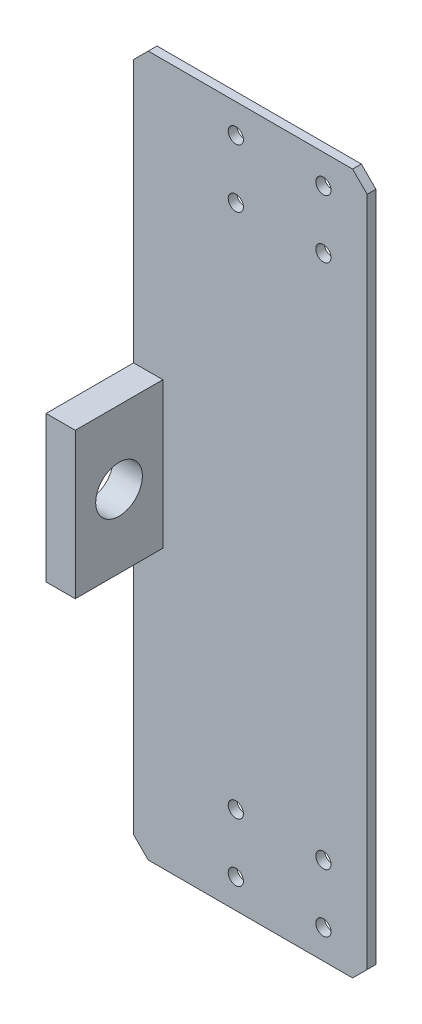
ISO-10303-21;
HEADER;
FILE_DESCRIPTION(('STEP AP214'),'2;1');
FILE_NAME('part.step','',(''),(''),'','','');
FILE_SCHEMA(('AUTOMOTIVE_DESIGN { 1 0 10303 214 1 1 1 1 }'));
ENDSEC;
DATA;
#1=APPLICATION_CONTEXT('core data for automotive mechanical design processes');
#2=APPLICATION_PROTOCOL_DEFINITION('international standard','automotive_design',2000,#1);
#3=PRODUCT_CONTEXT('',#1,'mechanical');
#4=PRODUCT('Part','Part','',(#3));
#5=PRODUCT_RELATED_PRODUCT_CATEGORY('part','',(#4));
#6=PRODUCT_DEFINITION_FORMATION('','',#4);
#7=PRODUCT_DEFINITION_CONTEXT('part definition',#1,'design');
#8=PRODUCT_DEFINITION('design','',#6,#7);
#9=PRODUCT_DEFINITION_SHAPE('','',#8);
#10=(LENGTH_UNIT() NAMED_UNIT(*) SI_UNIT(.MILLI.,.METRE.));
#11=(NAMED_UNIT(*) PLANE_ANGLE_UNIT() SI_UNIT($,.RADIAN.));
#12=(NAMED_UNIT(*) SI_UNIT($,.STERADIAN.) SOLID_ANGLE_UNIT());
#13=UNCERTAINTY_MEASURE_WITH_UNIT(LENGTH_MEASURE(1.E-05),#10,'distance_accuracy_value','');
#14=(GEOMETRIC_REPRESENTATION_CONTEXT(3) GLOBAL_UNCERTAINTY_ASSIGNED_CONTEXT((#13)) GLOBAL_UNIT_ASSIGNED_CONTEXT((#10,
#11,#12)) REPRESENTATION_CONTEXT('',''));
#15=CARTESIAN_POINT('',(0.,0.,0.));
#16=DIRECTION('',(0.,0.,1.));
#17=DIRECTION('',(1.,0.,0.));
#18=AXIS2_PLACEMENT_3D('',#15,#16,#17);
#19=CARTESIAN_POINT('',(0.,0.,3.));
#20=DIRECTION('',(0.,0.,1.));
#21=DIRECTION('',(1.,0.,0.));
#22=AXIS2_PLACEMENT_3D('',#19,#20,#21);
#23=PLANE('',#22);
#24=CARTESIAN_POINT('',(180.,90.,3.));
#25=DIRECTION('',(0.,0.,1.));
#26=DIRECTION('',(1.,0.,0.));
#27=AXIS2_PLACEMENT_3D('',#24,#25,#26);
#28=CIRCLE('',#27,2.59999999999999);
#29=CARTESIAN_POINT('',(182.6,90.,3.));
#30=VERTEX_POINT('',#29);
#31=EDGE_CURVE('E260',#30,#30,#28,.F.);
#32=ORIENTED_EDGE('',*,*,#31,.T.);
#33=EDGE_LOOP('',(#32));
#34=FACE_BOUND('',#33,.T.);
#35=CARTESIAN_POINT('',(180.,110.,3.));
#36=DIRECTION('',(0.,0.,1.));
#37=DIRECTION('',(1.,0.,0.));
#38=AXIS2_PLACEMENT_3D('',#35,#36,#37);
#39=CIRCLE('',#38,2.59999999999999);
#40=CARTESIAN_POINT('',(182.6,110.,3.));
#41=VERTEX_POINT('',#40);
#42=EDGE_CURVE('E268',#41,#41,#39,.F.);
#43=ORIENTED_EDGE('',*,*,#42,.T.);
#44=EDGE_LOOP('',(#43));
#45=FACE_BOUND('',#44,.T.);
#46=CARTESIAN_POINT('',(150.,110.,3.));
#47=DIRECTION('',(0.,0.,1.));
#48=DIRECTION('',(1.,0.,0.));
#49=AXIS2_PLACEMENT_3D('',#46,#47,#48);
#50=CIRCLE('',#49,2.59999999999999);
#51=CARTESIAN_POINT('',(152.6,110.,3.));
#52=VERTEX_POINT('',#51);
#53=EDGE_CURVE('E264',#52,#52,#50,.F.);
#54=ORIENTED_EDGE('',*,*,#53,.T.);
#55=EDGE_LOOP('',(#54));
#56=FACE_BOUND('',#55,.T.);
#57=CARTESIAN_POINT('',(150.,90.,3.));
#58=DIRECTION('',(0.,0.,1.));
#59=DIRECTION('',(1.,0.,0.));
#60=AXIS2_PLACEMENT_3D('',#57,#58,#59);
#61=CIRCLE('',#60,2.59999999999999);
#62=CARTESIAN_POINT('',(152.6,90.,3.));
#63=VERTEX_POINT('',#62);
#64=EDGE_CURVE('E233',#63,#63,#61,.F.);
#65=ORIENTED_EDGE('',*,*,#64,.T.);
#66=EDGE_LOOP('',(#65));
#67=FACE_BOUND('',#66,.T.);
#68=DIRECTION('',(1.,0.,0.));
#69=VECTOR('',#68,1.);
#70=CARTESIAN_POINT('',(115.,-25.,3.));
#71=LINE('',#70,#69);
#72=CARTESIAN_POINT('',(115.,-25.,3.));
#73=VERTEX_POINT('',#72);
#74=CARTESIAN_POINT('',(125.,-25.,3.));
#75=VERTEX_POINT('',#74);
#76=EDGE_CURVE('E59',#73,#75,#71,.T.);
#77=ORIENTED_EDGE('',*,*,#76,.F.);
#78=DIRECTION('',(0.,-1.,0.));
#79=VECTOR('',#78,1.);
#80=CARTESIAN_POINT('',(115.,0.,3.));
#81=LINE('',#80,#79);
#82=CARTESIAN_POINT('',(115.,-115.,3.));
#83=VERTEX_POINT('',#82);
#84=EDGE_CURVE('E151',#73,#83,#81,.T.);
#85=ORIENTED_EDGE('',*,*,#84,.T.);
#86=DIRECTION('',(-0.707106781186546,0.707106781186549,0.));
#87=VECTOR('',#86,1.);
#88=CARTESIAN_POINT('',(2.64953102402888E-13,2.64953102402886E-13,3.));
#89=LINE('',#88,#87);
#90=CARTESIAN_POINT('',(120.,-120.,3.));
#91=VERTEX_POINT('',#90);
#92=EDGE_CURVE('E175',#91,#83,#89,.T.);
#93=ORIENTED_EDGE('',*,*,#92,.F.);
#94=DIRECTION('',(1.,0.,0.));
#95=VECTOR('',#94,1.);
#96=CARTESIAN_POINT('',(0.,-120.,3.));
#97=LINE('',#96,#95);
#98=CARTESIAN_POINT('',(190.,-120.,3.));
#99=VERTEX_POINT('',#98);
#100=EDGE_CURVE('E196',#91,#99,#97,.T.);
#101=ORIENTED_EDGE('',*,*,#100,.T.);
#102=DIRECTION('',(0.707106781186543,0.707106781186552,0.));
#103=VECTOR('',#102,1.);
#104=CARTESIAN_POINT('',(155.000000000001,-154.999999999999,3.));
#105=LINE('',#104,#103);
#106=CARTESIAN_POINT('',(195.,-115.,3.));
#107=VERTEX_POINT('',#106);
#108=EDGE_CURVE('E198',#99,#107,#105,.T.);
#109=ORIENTED_EDGE('',*,*,#108,.T.);
#110=DIRECTION('',(0.,-1.,0.));
#111=VECTOR('',#110,1.);
#112=CARTESIAN_POINT('',(195.,0.,3.));
#113=LINE('',#112,#111);
#114=CARTESIAN_POINT('',(195.,115.,3.));
#115=VERTEX_POINT('',#114);
#116=EDGE_CURVE('E201',#115,#107,#113,.T.);
#117=ORIENTED_EDGE('',*,*,#116,.F.);
#118=DIRECTION('',(0.707106781186543,-0.707106781186552,0.));
#119=VECTOR('',#118,1.);
#120=CARTESIAN_POINT('',(155.000000000001,154.999999999999,3.));
#121=LINE('',#120,#119);
#122=CARTESIAN_POINT('',(190.,120.,3.));
#123=VERTEX_POINT('',#122);
#124=EDGE_CURVE('E204',#123,#115,#121,.T.);
#125=ORIENTED_EDGE('',*,*,#124,.F.);
#126=DIRECTION('',(1.,0.,0.));
#127=VECTOR('',#126,1.);
#128=CARTESIAN_POINT('',(0.,120.,3.));
#129=LINE('',#128,#127);
#130=CARTESIAN_POINT('',(120.,120.,3.));
#131=VERTEX_POINT('',#130);
#132=EDGE_CURVE('E207',#131,#123,#129,.T.);
#133=ORIENTED_EDGE('',*,*,#132,.F.);
#134=DIRECTION('',(0.707106781186548,0.707106781186548,0.));
#135=VECTOR('',#134,1.);
#136=CARTESIAN_POINT('',(0.,0.,3.));
#137=LINE('',#136,#135);
#138=CARTESIAN_POINT('',(115.,115.,3.));
#139=VERTEX_POINT('',#138);
#140=EDGE_CURVE('E184',#139,#131,#137,.T.);
#141=ORIENTED_EDGE('',*,*,#140,.F.);
#142=CARTESIAN_POINT('',(115.,25.,3.));
#143=VERTEX_POINT('',#142);
#144=EDGE_CURVE('E181',#139,#143,#81,.T.);
#145=ORIENTED_EDGE('',*,*,#144,.T.);
#146=DIRECTION('',(1.,0.,0.));
#147=VECTOR('',#146,1.);
#148=CARTESIAN_POINT('',(115.,25.,3.));
#149=LINE('',#148,#147);
#150=CARTESIAN_POINT('',(125.,25.,3.));
#151=VERTEX_POINT('',#150);
#152=EDGE_CURVE('E144',#143,#151,#149,.T.);
#153=ORIENTED_EDGE('',*,*,#152,.T.);
#154=DIRECTION('',(0.,-1.,0.));
#155=VECTOR('',#154,1.);
#156=CARTESIAN_POINT('',(125.,25.,3.));
#157=LINE('',#156,#155);
#158=EDGE_CURVE('E163',#151,#75,#157,.T.);
#159=ORIENTED_EDGE('',*,*,#158,.T.);
#160=EDGE_LOOP('',(#77,#85,#93,#101,#109,#117,#125,#133,#141,#145,#153,#159));
#161=FACE_BOUND('',#160,.T.);
#162=CARTESIAN_POINT('',(180.,-90.,3.));
#163=DIRECTION('',(0.,0.,1.));
#164=DIRECTION('',(1.,0.,0.));
#165=AXIS2_PLACEMENT_3D('',#162,#163,#164);
#166=CIRCLE('',#165,2.59999999999999);
#167=CARTESIAN_POINT('',(182.6,-90.,3.));
#168=VERTEX_POINT('',#167);
#169=EDGE_CURVE('E273',#168,#168,#166,.T.);
#170=ORIENTED_EDGE('',*,*,#169,.F.);
#171=EDGE_LOOP('',(#170));
#172=FACE_BOUND('',#171,.T.);
#173=CARTESIAN_POINT('',(180.,-110.,3.));
#174=DIRECTION('',(0.,0.,1.));
#175=DIRECTION('',(1.,0.,0.));
#176=AXIS2_PLACEMENT_3D('',#173,#174,#175);
#177=CIRCLE('',#176,2.59999999999999);
#178=CARTESIAN_POINT('',(182.6,-110.,3.));
#179=VERTEX_POINT('',#178);
#180=EDGE_CURVE('E276',#179,#179,#177,.T.);
#181=ORIENTED_EDGE('',*,*,#180,.F.);
#182=EDGE_LOOP('',(#181));
#183=FACE_BOUND('',#182,.T.);
#184=CARTESIAN_POINT('',(150.,-110.,3.));
#185=DIRECTION('',(0.,0.,1.));
#186=DIRECTION('',(1.,0.,0.));
#187=AXIS2_PLACEMENT_3D('',#184,#185,#186);
#188=CIRCLE('',#187,2.59999999999999);
#189=CARTESIAN_POINT('',(152.6,-110.,3.));
#190=VERTEX_POINT('',#189);
#191=EDGE_CURVE('E265',#190,#190,#188,.T.);
#192=ORIENTED_EDGE('',*,*,#191,.F.);
#193=EDGE_LOOP('',(#192));
#194=FACE_BOUND('',#193,.T.);
#195=CARTESIAN_POINT('',(150.,-90.,3.));
#196=DIRECTION('',(0.,0.,1.));
#197=DIRECTION('',(1.,0.,0.));
#198=AXIS2_PLACEMENT_3D('',#195,#196,#197);
#199=CIRCLE('',#198,2.59999999999999);
#200=CARTESIAN_POINT('',(152.6,-90.,3.));
#201=VERTEX_POINT('',#200);
#202=EDGE_CURVE('E261',#201,#201,#199,.T.);
#203=ORIENTED_EDGE('',*,*,#202,.F.);
#204=EDGE_LOOP('',(#203));
#205=FACE_BOUND('',#204,.T.);
#206=ADVANCED_FACE('F42',(#34,#45,#56,#67,#161,#172,#183,#194,#205),#23,.T.);
#207=CARTESIAN_POINT('',(0.,0.,0.));
#208=DIRECTION('',(0.,0.,1.));
#209=DIRECTION('',(1.,0.,0.));
#210=AXIS2_PLACEMENT_3D('',#207,#208,#209);
#211=PLANE('',#210);
#212=CARTESIAN_POINT('',(180.,90.,0.));
#213=DIRECTION('',(0.,0.,1.));
#214=DIRECTION('',(1.,0.,0.));
#215=AXIS2_PLACEMENT_3D('',#212,#213,#214);
#216=CIRCLE('',#215,2.59999999999999);
#217=CARTESIAN_POINT('',(182.6,90.,0.));
#218=VERTEX_POINT('',#217);
#219=EDGE_CURVE('E46',#218,#218,#216,.F.);
#220=ORIENTED_EDGE('',*,*,#219,.F.);
#221=EDGE_LOOP('',(#220));
#222=FACE_BOUND('',#221,.T.);
#223=CARTESIAN_POINT('',(180.,110.,0.));
#224=DIRECTION('',(0.,0.,1.));
#225=DIRECTION('',(1.,0.,0.));
#226=AXIS2_PLACEMENT_3D('',#223,#224,#225);
#227=CIRCLE('',#226,2.59999999999999);
#228=CARTESIAN_POINT('',(182.6,110.,0.));
#229=VERTEX_POINT('',#228);
#230=EDGE_CURVE('E247',#229,#229,#227,.F.);
#231=ORIENTED_EDGE('',*,*,#230,.F.);
#232=EDGE_LOOP('',(#231));
#233=FACE_BOUND('',#232,.T.);
#234=CARTESIAN_POINT('',(150.,110.,0.));
#235=DIRECTION('',(0.,0.,1.));
#236=DIRECTION('',(1.,0.,0.));
#237=AXIS2_PLACEMENT_3D('',#234,#235,#236);
#238=CIRCLE('',#237,2.59999999999999);
#239=CARTESIAN_POINT('',(152.6,110.,0.));
#240=VERTEX_POINT('',#239);
#241=EDGE_CURVE('E245',#240,#240,#238,.F.);
#242=ORIENTED_EDGE('',*,*,#241,.F.);
#243=EDGE_LOOP('',(#242));
#244=FACE_BOUND('',#243,.T.);
#245=CARTESIAN_POINT('',(150.,-110.,0.));
#246=DIRECTION('',(0.,0.,1.));
#247=DIRECTION('',(1.,0.,0.));
#248=AXIS2_PLACEMENT_3D('',#245,#246,#247);
#249=CIRCLE('',#248,2.59999999999999);
#250=CARTESIAN_POINT('',(152.6,-110.,0.));
#251=VERTEX_POINT('',#250);
#252=EDGE_CURVE('E239',#251,#251,#249,.T.);
#253=ORIENTED_EDGE('',*,*,#252,.T.);
#254=EDGE_LOOP('',(#253));
#255=FACE_BOUND('',#254,.T.);
#256=CARTESIAN_POINT('',(180.,-90.,0.));
#257=DIRECTION('',(0.,0.,1.));
#258=DIRECTION('',(1.,0.,0.));
#259=AXIS2_PLACEMENT_3D('',#256,#257,#258);
#260=CIRCLE('',#259,2.59999999999999);
#261=CARTESIAN_POINT('',(182.6,-90.,0.));
#262=VERTEX_POINT('',#261);
#263=EDGE_CURVE('E232',#262,#262,#260,.T.);
#264=ORIENTED_EDGE('',*,*,#263,.T.);
#265=EDGE_LOOP('',(#264));
#266=FACE_BOUND('',#265,.T.);
#267=CARTESIAN_POINT('',(150.,90.,0.));
#268=DIRECTION('',(0.,0.,1.));
#269=DIRECTION('',(1.,0.,0.));
#270=AXIS2_PLACEMENT_3D('',#267,#268,#269);
#271=CIRCLE('',#270,2.59999999999999);
#272=CARTESIAN_POINT('',(152.6,90.,0.));
#273=VERTEX_POINT('',#272);
#274=EDGE_CURVE('E229',#273,#273,#271,.F.);
#275=ORIENTED_EDGE('',*,*,#274,.F.);
#276=EDGE_LOOP('',(#275));
#277=FACE_BOUND('',#276,.T.);
#278=DIRECTION('',(1.,0.,0.));
#279=VECTOR('',#278,1.);
#280=CARTESIAN_POINT('',(0.,-120.,0.));
#281=LINE('',#280,#279);
#282=CARTESIAN_POINT('',(120.,-120.,0.));
#283=VERTEX_POINT('',#282);
#284=CARTESIAN_POINT('',(190.,-120.,0.));
#285=VERTEX_POINT('',#284);
#286=EDGE_CURVE('E191',#283,#285,#281,.T.);
#287=ORIENTED_EDGE('',*,*,#286,.F.);
#288=DIRECTION('',(-0.707106781186546,0.707106781186549,0.));
#289=VECTOR('',#288,1.);
#290=CARTESIAN_POINT('',(2.64953102402888E-13,2.64953102402886E-13,0.));
#291=LINE('',#290,#289);
#292=CARTESIAN_POINT('',(115.,-115.,0.));
#293=VERTEX_POINT('',#292);
#294=EDGE_CURVE('E177',#283,#293,#291,.T.);
#295=ORIENTED_EDGE('',*,*,#294,.T.);
#296=DIRECTION('',(0.,-1.,0.));
#297=VECTOR('',#296,1.);
#298=CARTESIAN_POINT('',(115.,0.,0.));
#299=LINE('',#298,#297);
#300=CARTESIAN_POINT('',(115.,115.,0.));
#301=VERTEX_POINT('',#300);
#302=EDGE_CURVE('E172',#301,#293,#299,.T.);
#303=ORIENTED_EDGE('',*,*,#302,.F.);
#304=DIRECTION('',(0.707106781186548,0.707106781186548,0.));
#305=VECTOR('',#304,1.);
#306=CARTESIAN_POINT('',(0.,0.,0.));
#307=LINE('',#306,#305);
#308=CARTESIAN_POINT('',(120.,120.,0.));
#309=VERTEX_POINT('',#308);
#310=EDGE_CURVE('E174',#301,#309,#307,.T.);
#311=ORIENTED_EDGE('',*,*,#310,.T.);
#312=DIRECTION('',(1.,0.,0.));
#313=VECTOR('',#312,1.);
#314=CARTESIAN_POINT('',(0.,120.,0.));
#315=LINE('',#314,#313);
#316=CARTESIAN_POINT('',(190.,120.,0.));
#317=VERTEX_POINT('',#316);
#318=EDGE_CURVE('E199',#309,#317,#315,.T.);
#319=ORIENTED_EDGE('',*,*,#318,.T.);
#320=DIRECTION('',(0.707106781186543,-0.707106781186552,0.));
#321=VECTOR('',#320,1.);
#322=CARTESIAN_POINT('',(155.000000000001,154.999999999999,0.));
#323=LINE('',#322,#321);
#324=CARTESIAN_POINT('',(195.,115.,0.));
#325=VERTEX_POINT('',#324);
#326=EDGE_CURVE('E217',#317,#325,#323,.T.);
#327=ORIENTED_EDGE('',*,*,#326,.T.);
#328=DIRECTION('',(0.,-1.,0.));
#329=VECTOR('',#328,1.);
#330=CARTESIAN_POINT('',(195.,0.,0.));
#331=LINE('',#330,#329);
#332=CARTESIAN_POINT('',(195.,-115.,0.));
#333=VERTEX_POINT('',#332);
#334=EDGE_CURVE('E214',#325,#333,#331,.T.);
#335=ORIENTED_EDGE('',*,*,#334,.T.);
#336=DIRECTION('',(0.707106781186543,0.707106781186552,0.));
#337=VECTOR('',#336,1.);
#338=CARTESIAN_POINT('',(155.000000000001,-154.999999999999,0.));
#339=LINE('',#338,#337);
#340=EDGE_CURVE('E211',#285,#333,#339,.T.);
#341=ORIENTED_EDGE('',*,*,#340,.F.);
#342=EDGE_LOOP('',(#287,#295,#303,#311,#319,#327,#335,#341));
#343=FACE_BOUND('',#342,.T.);
#344=CARTESIAN_POINT('',(180.,-110.,0.));
#345=DIRECTION('',(0.,0.,1.));
#346=DIRECTION('',(1.,0.,0.));
#347=AXIS2_PLACEMENT_3D('',#344,#345,#346);
#348=CIRCLE('',#347,2.59999999999999);
#349=CARTESIAN_POINT('',(182.6,-110.,0.));
#350=VERTEX_POINT('',#349);
#351=EDGE_CURVE('E236',#350,#350,#348,.T.);
#352=ORIENTED_EDGE('',*,*,#351,.T.);
#353=EDGE_LOOP('',(#352));
#354=FACE_BOUND('',#353,.T.);
#355=CARTESIAN_POINT('',(150.,-90.,0.));
#356=DIRECTION('',(0.,0.,1.));
#357=DIRECTION('',(1.,0.,0.));
#358=AXIS2_PLACEMENT_3D('',#355,#356,#357);
#359=CIRCLE('',#358,2.59999999999999);
#360=CARTESIAN_POINT('',(152.6,-90.,0.));
#361=VERTEX_POINT('',#360);
#362=EDGE_CURVE('E242',#361,#361,#359,.T.);
#363=ORIENTED_EDGE('',*,*,#362,.T.);
#364=EDGE_LOOP('',(#363));
#365=FACE_BOUND('',#364,.T.);
#366=ADVANCED_FACE('F287',(#222,#233,#244,#255,#266,#277,#343,#354,#365),#211,.F.);
#367=CARTESIAN_POINT('',(0.,-120.,3.));
#368=DIRECTION('',(0.,1.,0.));
#369=DIRECTION('',(0.,0.,1.));
#370=AXIS2_PLACEMENT_3D('',#367,#368,#369);
#371=PLANE('',#370);
#372=ORIENTED_EDGE('',*,*,#100,.F.);
#373=DIRECTION('',(0.,0.,1.));
#374=VECTOR('',#373,1.);
#375=CARTESIAN_POINT('',(120.,-120.,0.));
#376=LINE('',#375,#374);
#377=EDGE_CURVE('E192',#283,#91,#376,.T.);
#378=ORIENTED_EDGE('',*,*,#377,.F.);
#379=ORIENTED_EDGE('',*,*,#286,.T.);
#380=DIRECTION('',(0.,0.,-1.));
#381=VECTOR('',#380,1.);
#382=CARTESIAN_POINT('',(190.,-120.,3.));
#383=LINE('',#382,#381);
#384=EDGE_CURVE('E11',#99,#285,#383,.T.);
#385=ORIENTED_EDGE('',*,*,#384,.F.);
#386=EDGE_LOOP('',(#372,#378,#379,#385));
#387=FACE_BOUND('',#386,.T.);
#388=ADVANCED_FACE('F44',(#387),#371,.F.);
#389=CARTESIAN_POINT('',(155.000000000001,-154.999999999999,3.));
#390=DIRECTION('',(-0.707106781186552,0.707106781186543,0.));
#391=DIRECTION('',(-0.707106781186543,-0.707106781186552,0.));
#392=AXIS2_PLACEMENT_3D('',#389,#390,#391);
#393=PLANE('',#392);
#394=ORIENTED_EDGE('',*,*,#340,.T.);
#395=DIRECTION('',(0.,0.,-1.));
#396=VECTOR('',#395,1.);
#397=CARTESIAN_POINT('',(195.,-115.,3.));
#398=LINE('',#397,#396);
#399=EDGE_CURVE('E51',#107,#333,#398,.T.);
#400=ORIENTED_EDGE('',*,*,#399,.F.);
#401=ORIENTED_EDGE('',*,*,#108,.F.);
#402=ORIENTED_EDGE('',*,*,#384,.T.);
#403=EDGE_LOOP('',(#394,#400,#401,#402));
#404=FACE_BOUND('',#403,.T.);
#405=ADVANCED_FACE('F305',(#404),#393,.F.);
#406=CARTESIAN_POINT('',(195.,0.,3.));
#407=DIRECTION('',(1.,0.,0.));
#408=DIRECTION('',(0.,1.,0.));
#409=AXIS2_PLACEMENT_3D('',#406,#407,#408);
#410=PLANE('',#409);
#411=ORIENTED_EDGE('',*,*,#334,.F.);
#412=DIRECTION('',(0.,0.,-1.));
#413=VECTOR('',#412,1.);
#414=CARTESIAN_POINT('',(195.,115.,3.));
#415=LINE('',#414,#413);
#416=EDGE_CURVE('E223',#115,#325,#415,.T.);
#417=ORIENTED_EDGE('',*,*,#416,.F.);
#418=ORIENTED_EDGE('',*,*,#116,.T.);
#419=ORIENTED_EDGE('',*,*,#399,.T.);
#420=EDGE_LOOP('',(#411,#417,#418,#419));
#421=FACE_BOUND('',#420,.T.);
#422=ADVANCED_FACE('F318',(#421),#410,.T.);
#423=CARTESIAN_POINT('',(155.000000000001,154.999999999999,3.));
#424=DIRECTION('',(0.707106781186552,0.707106781186543,0.));
#425=DIRECTION('',(-0.707106781186543,0.707106781186552,0.));
#426=AXIS2_PLACEMENT_3D('',#423,#424,#425);
#427=PLANE('',#426);
#428=ORIENTED_EDGE('',*,*,#326,.F.);
#429=DIRECTION('',(0.,0.,-1.));
#430=VECTOR('',#429,1.);
#431=CARTESIAN_POINT('',(190.,120.,3.));
#432=LINE('',#431,#430);
#433=EDGE_CURVE('E209',#123,#317,#432,.T.);
#434=ORIENTED_EDGE('',*,*,#433,.F.);
#435=ORIENTED_EDGE('',*,*,#124,.T.);
#436=ORIENTED_EDGE('',*,*,#416,.T.);
#437=EDGE_LOOP('',(#428,#434,#435,#436));
#438=FACE_BOUND('',#437,.T.);
#439=ADVANCED_FACE('F314',(#438),#427,.T.);
#440=CARTESIAN_POINT('',(0.,120.,3.));
#441=DIRECTION('',(0.,1.,0.));
#442=DIRECTION('',(-1.,0.,0.));
#443=AXIS2_PLACEMENT_3D('',#440,#441,#442);
#444=PLANE('',#443);
#445=DIRECTION('',(0.,0.,1.));
#446=VECTOR('',#445,1.);
#447=CARTESIAN_POINT('',(120.,120.,0.));
#448=LINE('',#447,#446);
#449=EDGE_CURVE('E67',#309,#131,#448,.T.);
#450=ORIENTED_EDGE('',*,*,#449,.T.);
#451=ORIENTED_EDGE('',*,*,#132,.T.);
#452=ORIENTED_EDGE('',*,*,#433,.T.);
#453=ORIENTED_EDGE('',*,*,#318,.F.);
#454=EDGE_LOOP('',(#450,#451,#452,#453));
#455=FACE_BOUND('',#454,.T.);
#456=ADVANCED_FACE('F310',(#455),#444,.T.);
#457=CARTESIAN_POINT('',(115.,0.,0.));
#458=DIRECTION('',(-1.,0.,0.));
#459=DIRECTION('',(0.,-1.,0.));
#460=AXIS2_PLACEMENT_3D('',#457,#458,#459);
#461=PLANE('',#460);
#462=CARTESIAN_POINT('',(115.,0.,18.0000000000003));
#463=DIRECTION('',(-1.,0.,0.));
#464=DIRECTION('',(0.,-1.,0.));
#465=AXIS2_PLACEMENT_3D('',#462,#463,#464);
#466=CIRCLE('',#465,8.);
#467=CARTESIAN_POINT('',(115.,-7.99999999999999,18.0000000000003));
#468=VERTEX_POINT('',#467);
#469=EDGE_CURVE('E228',#468,#468,#466,.T.);
#470=ORIENTED_EDGE('',*,*,#469,.F.);
#471=EDGE_LOOP('',(#470));
#472=FACE_BOUND('',#471,.T.);
#473=ORIENTED_EDGE('',*,*,#144,.F.);
#474=DIRECTION('',(0.,0.,1.));
#475=VECTOR('',#474,1.);
#476=CARTESIAN_POINT('',(115.,115.,0.));
#477=LINE('',#476,#475);
#478=EDGE_CURVE('E180',#301,#139,#477,.T.);
#479=ORIENTED_EDGE('',*,*,#478,.F.);
#480=ORIENTED_EDGE('',*,*,#302,.T.);
#481=DIRECTION('',(0.,0.,1.));
#482=VECTOR('',#481,1.);
#483=CARTESIAN_POINT('',(115.,-115.,0.));
#484=LINE('',#483,#482);
#485=EDGE_CURVE('E188',#293,#83,#484,.T.);
#486=ORIENTED_EDGE('',*,*,#485,.T.);
#487=ORIENTED_EDGE('',*,*,#84,.F.);
#488=DIRECTION('',(0.,0.,-1.));
#489=VECTOR('',#488,1.);
#490=CARTESIAN_POINT('',(115.,-25.,33.));
#491=LINE('',#490,#489);
#492=CARTESIAN_POINT('',(115.,-25.,33.));
#493=VERTEX_POINT('',#492);
#494=EDGE_CURVE('E161',#493,#73,#491,.T.);
#495=ORIENTED_EDGE('',*,*,#494,.F.);
#496=DIRECTION('',(0.,-1.,0.));
#497=VECTOR('',#496,1.);
#498=CARTESIAN_POINT('',(115.,25.,33.));
#499=LINE('',#498,#497);
#500=CARTESIAN_POINT('',(115.,25.,33.));
#501=VERTEX_POINT('',#500);
#502=EDGE_CURVE('E142',#501,#493,#499,.T.);
#503=ORIENTED_EDGE('',*,*,#502,.F.);
#504=DIRECTION('',(0.,0.,-1.));
#505=VECTOR('',#504,1.);
#506=CARTESIAN_POINT('',(115.,25.,33.));
#507=LINE('',#506,#505);
#508=EDGE_CURVE('E169',#501,#143,#507,.T.);
#509=ORIENTED_EDGE('',*,*,#508,.T.);
#510=EDGE_LOOP('',(#473,#479,#480,#486,#487,#495,#503,#509));
#511=FACE_BOUND('',#510,.T.);
#512=ADVANCED_FACE('F313',(#472,#511),#461,.T.);
#513=CARTESIAN_POINT('',(2.64953102402888E-13,2.64953102402886E-13,0.));
#514=DIRECTION('',(0.707106781186549,0.707106781186546,0.));
#515=DIRECTION('',(-0.707106781186546,0.707106781186549,0.));
#516=AXIS2_PLACEMENT_3D('',#513,#514,#515);
#517=PLANE('',#516);
#518=ORIENTED_EDGE('',*,*,#92,.T.);
#519=ORIENTED_EDGE('',*,*,#485,.F.);
#520=ORIENTED_EDGE('',*,*,#294,.F.);
#521=ORIENTED_EDGE('',*,*,#377,.T.);
#522=EDGE_LOOP('',(#518,#519,#520,#521));
#523=FACE_BOUND('',#522,.T.);
#524=ADVANCED_FACE('F354',(#523),#517,.F.);
#525=CARTESIAN_POINT('',(0.,0.,0.));
#526=DIRECTION('',(0.707106781186547,-0.707106781186547,0.));
#527=DIRECTION('',(0.707106781186548,0.707106781186548,0.));
#528=AXIS2_PLACEMENT_3D('',#525,#526,#527);
#529=PLANE('',#528);
#530=ORIENTED_EDGE('',*,*,#140,.T.);
#531=ORIENTED_EDGE('',*,*,#449,.F.);
#532=ORIENTED_EDGE('',*,*,#310,.F.);
#533=ORIENTED_EDGE('',*,*,#478,.T.);
#534=EDGE_LOOP('',(#530,#531,#532,#533));
#535=FACE_BOUND('',#534,.T.);
#536=ADVANCED_FACE('F344',(#535),#529,.F.);
#537=CARTESIAN_POINT('',(115.,-25.,33.));
#538=DIRECTION('',(0.,1.,0.));
#539=DIRECTION('',(-1.,0.,0.));
#540=AXIS2_PLACEMENT_3D('',#537,#538,#539);
#541=PLANE('',#540);
#542=ORIENTED_EDGE('',*,*,#76,.T.);
#543=DIRECTION('',(0.,0.,-1.));
#544=VECTOR('',#543,1.);
#545=CARTESIAN_POINT('',(125.,-25.,33.));
#546=LINE('',#545,#544);
#547=CARTESIAN_POINT('',(125.,-25.,33.));
#548=VERTEX_POINT('',#547);
#549=EDGE_CURVE('E146',#548,#75,#546,.T.);
#550=ORIENTED_EDGE('',*,*,#549,.F.);
#551=DIRECTION('',(1.,0.,0.));
#552=VECTOR('',#551,1.);
#553=CARTESIAN_POINT('',(115.,-25.,33.));
#554=LINE('',#553,#552);
#555=EDGE_CURVE('E135',#493,#548,#554,.T.);
#556=ORIENTED_EDGE('',*,*,#555,.F.);
#557=ORIENTED_EDGE('',*,*,#494,.T.);
#558=EDGE_LOOP('',(#542,#550,#556,#557));
#559=FACE_BOUND('',#558,.T.);
#560=ADVANCED_FACE('F147',(#559),#541,.F.);
#561=CARTESIAN_POINT('',(125.,25.,33.));
#562=DIRECTION('',(1.,0.,0.));
#563=DIRECTION('',(0.,1.,0.));
#564=AXIS2_PLACEMENT_3D('',#561,#562,#563);
#565=PLANE('',#564);
#566=CARTESIAN_POINT('',(125.,0.,18.0000000000003));
#567=DIRECTION('',(1.,0.,0.));
#568=DIRECTION('',(0.,1.,0.));
#569=AXIS2_PLACEMENT_3D('',#566,#567,#568);
#570=CIRCLE('',#569,8.);
#571=CARTESIAN_POINT('',(125.,8.00000000000002,18.0000000000003));
#572=VERTEX_POINT('',#571);
#573=EDGE_CURVE('E164',#572,#572,#570,.T.);
#574=ORIENTED_EDGE('',*,*,#573,.F.);
#575=EDGE_LOOP('',(#574));
#576=FACE_BOUND('',#575,.T.);
#577=ORIENTED_EDGE('',*,*,#158,.F.);
#578=DIRECTION('',(0.,0.,-1.));
#579=VECTOR('',#578,1.);
#580=CARTESIAN_POINT('',(125.,25.,33.));
#581=LINE('',#580,#579);
#582=CARTESIAN_POINT('',(125.,25.,33.));
#583=VERTEX_POINT('',#582);
#584=EDGE_CURVE('E152',#583,#151,#581,.T.);
#585=ORIENTED_EDGE('',*,*,#584,.F.);
#586=DIRECTION('',(0.,-1.,0.));
#587=VECTOR('',#586,1.);
#588=CARTESIAN_POINT('',(125.,25.,33.));
#589=LINE('',#588,#587);
#590=EDGE_CURVE('E139',#583,#548,#589,.T.);
#591=ORIENTED_EDGE('',*,*,#590,.T.);
#592=ORIENTED_EDGE('',*,*,#549,.T.);
#593=EDGE_LOOP('',(#577,#585,#591,#592));
#594=FACE_BOUND('',#593,.T.);
#595=ADVANCED_FACE('F154',(#576,#594),#565,.T.);
#596=CARTESIAN_POINT('',(115.,25.,33.));
#597=DIRECTION('',(0.,1.,0.));
#598=DIRECTION('',(0.,0.,1.));
#599=AXIS2_PLACEMENT_3D('',#596,#597,#598);
#600=PLANE('',#599);
#601=ORIENTED_EDGE('',*,*,#152,.F.);
#602=ORIENTED_EDGE('',*,*,#508,.F.);
#603=DIRECTION('',(1.,0.,0.));
#604=VECTOR('',#603,1.);
#605=CARTESIAN_POINT('',(115.,25.,33.));
#606=LINE('',#605,#604);
#607=EDGE_CURVE('E155',#501,#583,#606,.T.);
#608=ORIENTED_EDGE('',*,*,#607,.T.);
#609=ORIENTED_EDGE('',*,*,#584,.T.);
#610=EDGE_LOOP('',(#601,#602,#608,#609));
#611=FACE_BOUND('',#610,.T.);
#612=ADVANCED_FACE('F349',(#611),#600,.T.);
#613=CARTESIAN_POINT('',(0.,0.,33.));
#614=DIRECTION('',(0.,0.,-1.));
#615=DIRECTION('',(-1.,0.,0.));
#616=AXIS2_PLACEMENT_3D('',#613,#614,#615);
#617=PLANE('',#616);
#618=ORIENTED_EDGE('',*,*,#555,.T.);
#619=ORIENTED_EDGE('',*,*,#590,.F.);
#620=ORIENTED_EDGE('',*,*,#607,.F.);
#621=ORIENTED_EDGE('',*,*,#502,.T.);
#622=EDGE_LOOP('',(#618,#619,#620,#621));
#623=FACE_BOUND('',#622,.T.);
#624=ADVANCED_FACE('F136',(#623),#617,.F.);
#625=CARTESIAN_POINT('',(145.,0.,18.0000000000003));
#626=DIRECTION('',(-1.,0.,0.));
#627=DIRECTION('',(0.,-1.,0.));
#628=AXIS2_PLACEMENT_3D('',#625,#626,#627);
#629=CYLINDRICAL_SURFACE('',#628,8.);
#630=ORIENTED_EDGE('',*,*,#573,.T.);
#631=EDGE_LOOP('',(#630));
#632=FACE_BOUND('',#631,.T.);
#633=ORIENTED_EDGE('',*,*,#469,.T.);
#634=EDGE_LOOP('',(#633));
#635=FACE_BOUND('',#634,.T.);
#636=ADVANCED_FACE('F375',(#632,#635),#629,.F.);
#637=CARTESIAN_POINT('',(150.,90.,-7.));
#638=DIRECTION('',(0.,0.,1.));
#639=DIRECTION('',(1.,0.,0.));
#640=AXIS2_PLACEMENT_3D('',#637,#638,#639);
#641=CYLINDRICAL_SURFACE('',#640,2.59999999999999);
#642=ORIENTED_EDGE('',*,*,#64,.F.);
#643=EDGE_LOOP('',(#642));
#644=FACE_BOUND('',#643,.T.);
#645=ORIENTED_EDGE('',*,*,#274,.T.);
#646=EDGE_LOOP('',(#645));
#647=FACE_BOUND('',#646,.T.);
#648=ADVANCED_FACE('F378',(#644,#647),#641,.F.);
#649=CARTESIAN_POINT('',(180.,-90.,-7.));
#650=DIRECTION('',(0.,0.,1.));
#651=DIRECTION('',(1.,0.,0.));
#652=AXIS2_PLACEMENT_3D('',#649,#650,#651);
#653=CYLINDRICAL_SURFACE('',#652,2.59999999999999);
#654=ORIENTED_EDGE('',*,*,#169,.T.);
#655=EDGE_LOOP('',(#654));
#656=FACE_BOUND('',#655,.T.);
#657=ORIENTED_EDGE('',*,*,#263,.F.);
#658=EDGE_LOOP('',(#657));
#659=FACE_BOUND('',#658,.T.);
#660=ADVANCED_FACE('F381',(#656,#659),#653,.F.);
#661=CARTESIAN_POINT('',(180.,-110.,-7.));
#662=DIRECTION('',(0.,0.,1.));
#663=DIRECTION('',(1.,0.,0.));
#664=AXIS2_PLACEMENT_3D('',#661,#662,#663);
#665=CYLINDRICAL_SURFACE('',#664,2.59999999999999);
#666=ORIENTED_EDGE('',*,*,#180,.T.);
#667=EDGE_LOOP('',(#666));
#668=FACE_BOUND('',#667,.T.);
#669=ORIENTED_EDGE('',*,*,#351,.F.);
#670=EDGE_LOOP('',(#669));
#671=FACE_BOUND('',#670,.T.);
#672=ADVANCED_FACE('F397',(#668,#671),#665,.F.);
#673=CARTESIAN_POINT('',(150.,-110.,-7.));
#674=DIRECTION('',(0.,0.,1.));
#675=DIRECTION('',(1.,0.,0.));
#676=AXIS2_PLACEMENT_3D('',#673,#674,#675);
#677=CYLINDRICAL_SURFACE('',#676,2.59999999999999);
#678=ORIENTED_EDGE('',*,*,#191,.T.);
#679=EDGE_LOOP('',(#678));
#680=FACE_BOUND('',#679,.T.);
#681=ORIENTED_EDGE('',*,*,#252,.F.);
#682=EDGE_LOOP('',(#681));
#683=FACE_BOUND('',#682,.T.);
#684=ADVANCED_FACE('F282',(#680,#683),#677,.F.);
#685=CARTESIAN_POINT('',(150.,-90.,-7.));
#686=DIRECTION('',(0.,0.,1.));
#687=DIRECTION('',(1.,0.,0.));
#688=AXIS2_PLACEMENT_3D('',#685,#686,#687);
#689=CYLINDRICAL_SURFACE('',#688,2.59999999999999);
#690=ORIENTED_EDGE('',*,*,#202,.T.);
#691=EDGE_LOOP('',(#690));
#692=FACE_BOUND('',#691,.T.);
#693=ORIENTED_EDGE('',*,*,#362,.F.);
#694=EDGE_LOOP('',(#693));
#695=FACE_BOUND('',#694,.T.);
#696=ADVANCED_FACE('F292',(#692,#695),#689,.F.);
#697=CARTESIAN_POINT('',(150.,110.,-7.));
#698=DIRECTION('',(0.,0.,1.));
#699=DIRECTION('',(1.,0.,0.));
#700=AXIS2_PLACEMENT_3D('',#697,#698,#699);
#701=CYLINDRICAL_SURFACE('',#700,2.59999999999999);
#702=ORIENTED_EDGE('',*,*,#53,.F.);
#703=EDGE_LOOP('',(#702));
#704=FACE_BOUND('',#703,.T.);
#705=ORIENTED_EDGE('',*,*,#241,.T.);
#706=EDGE_LOOP('',(#705));
#707=FACE_BOUND('',#706,.T.);
#708=ADVANCED_FACE('F295',(#704,#707),#701,.F.);
#709=CARTESIAN_POINT('',(180.,110.,-7.));
#710=DIRECTION('',(0.,0.,1.));
#711=DIRECTION('',(1.,0.,0.));
#712=AXIS2_PLACEMENT_3D('',#709,#710,#711);
#713=CYLINDRICAL_SURFACE('',#712,2.59999999999999);
#714=ORIENTED_EDGE('',*,*,#42,.F.);
#715=EDGE_LOOP('',(#714));
#716=FACE_BOUND('',#715,.T.);
#717=ORIENTED_EDGE('',*,*,#230,.T.);
#718=EDGE_LOOP('',(#717));
#719=FACE_BOUND('',#718,.T.);
#720=ADVANCED_FACE('F386',(#716,#719),#713,.F.);
#721=CARTESIAN_POINT('',(180.,90.,-7.));
#722=DIRECTION('',(0.,0.,1.));
#723=DIRECTION('',(1.,0.,0.));
#724=AXIS2_PLACEMENT_3D('',#721,#722,#723);
#725=CYLINDRICAL_SURFACE('',#724,2.59999999999999);
#726=ORIENTED_EDGE('',*,*,#31,.F.);
#727=EDGE_LOOP('',(#726));
#728=FACE_BOUND('',#727,.T.);
#729=ORIENTED_EDGE('',*,*,#219,.T.);
#730=EDGE_LOOP('',(#729));
#731=FACE_BOUND('',#730,.T.);
#732=ADVANCED_FACE('F390',(#728,#731),#725,.F.);
#733=CLOSED_SHELL('',(#206,#366,#388,#405,#422,#439,#456,#512,#524,#536,#560,#595,#612,#624,
#636,#648,#660,#672,#684,#696,#708,#720,#732));
#734=MANIFOLD_SOLID_BREP('B2',#733);
#735=ADVANCED_BREP_SHAPE_REPRESENTATION('',(#18,#734),#14);
#736=SHAPE_DEFINITION_REPRESENTATION(#9,#735);
ENDSEC;
END-ISO-10303-21;
